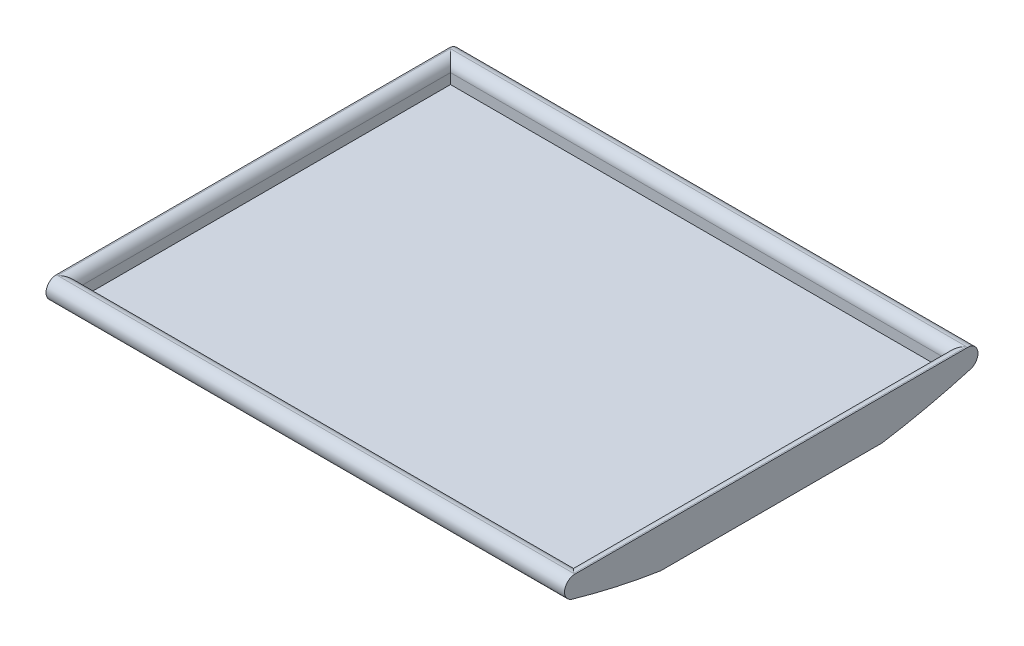
ISO-10303-21;
HEADER;
FILE_DESCRIPTION(('STEP AP214'),'2;1');
FILE_NAME('part.step','',(''),(''),'','','');
FILE_SCHEMA(('AUTOMOTIVE_DESIGN { 1 0 10303 214 1 1 1 1 }'));
ENDSEC;
DATA;
#1=APPLICATION_CONTEXT('core data for automotive mechanical design processes');
#2=APPLICATION_PROTOCOL_DEFINITION('international standard','automotive_design',2000,#1);
#3=PRODUCT_CONTEXT('',#1,'mechanical');
#4=PRODUCT('Part','Part','',(#3));
#5=PRODUCT_RELATED_PRODUCT_CATEGORY('part','',(#4));
#6=PRODUCT_DEFINITION_FORMATION('','',#4);
#7=PRODUCT_DEFINITION_CONTEXT('part definition',#1,'design');
#8=PRODUCT_DEFINITION('design','',#6,#7);
#9=PRODUCT_DEFINITION_SHAPE('','',#8);
#10=(LENGTH_UNIT() NAMED_UNIT(*) SI_UNIT(.MILLI.,.METRE.));
#11=(NAMED_UNIT(*) PLANE_ANGLE_UNIT() SI_UNIT($,.RADIAN.));
#12=(NAMED_UNIT(*) SI_UNIT($,.STERADIAN.) SOLID_ANGLE_UNIT());
#13=UNCERTAINTY_MEASURE_WITH_UNIT(LENGTH_MEASURE(1.E-05),#10,'distance_accuracy_value','');
#14=(GEOMETRIC_REPRESENTATION_CONTEXT(3) GLOBAL_UNCERTAINTY_ASSIGNED_CONTEXT((#13)) GLOBAL_UNIT_ASSIGNED_CONTEXT((#10,
#11,#12)) REPRESENTATION_CONTEXT('',''));
#15=CARTESIAN_POINT('',(0.,0.,0.));
#16=DIRECTION('',(0.,0.,1.));
#17=DIRECTION('',(1.,0.,0.));
#18=AXIS2_PLACEMENT_3D('',#15,#16,#17);
#19=CARTESIAN_POINT('',(35.,-1.55324312984151,-17.4264168846469));
#20=DIRECTION('',(0.,-1.,0.));
#21=DIRECTION('',(0.,0.,-1.));
#22=AXIS2_PLACEMENT_3D('',#19,#20,#21);
#23=PLANE('',#22);
#24=DIRECTION('',(-1.,0.,0.));
#25=VECTOR('',#24,1.);
#26=CARTESIAN_POINT('',(35.,-1.5532431298415,-32.5735831153531));
#27=LINE('',#26,#25);
#28=CARTESIAN_POINT('',(35.,-1.5532431298415,-32.5735831153531));
#29=VERTEX_POINT('',#28);
#30=CARTESIAN_POINT('',(34.9504058124932,-1.5532431298415,-32.5735831153531));
#31=VERTEX_POINT('',#30);
#32=EDGE_CURVE('E206',#29,#31,#27,.T.);
#33=ORIENTED_EDGE('',*,*,#32,.T.);
#34=DIRECTION('',(0.,0.,-1.));
#35=VECTOR('',#34,1.);
#36=CARTESIAN_POINT('',(34.9504058124932,-1.55324312984151,-17.4264168846469));
#37=LINE('',#36,#35);
#38=CARTESIAN_POINT('',(34.9504058124932,-1.55324312984151,-17.4264168846469));
#39=VERTEX_POINT('',#38);
#40=EDGE_CURVE('E239',#31,#39,#37,.F.);
#41=ORIENTED_EDGE('',*,*,#40,.T.);
#42=DIRECTION('',(-1.,0.,0.));
#43=VECTOR('',#42,1.);
#44=CARTESIAN_POINT('',(35.,-1.55324312984151,-17.4264168846469));
#45=LINE('',#44,#43);
#46=CARTESIAN_POINT('',(35.,-1.55324312984151,-17.4264168846469));
#47=VERTEX_POINT('',#46);
#48=EDGE_CURVE('E202',#47,#39,#45,.T.);
#49=ORIENTED_EDGE('',*,*,#48,.F.);
#50=DIRECTION('',(0.,0.,1.));
#51=VECTOR('',#50,1.);
#52=CARTESIAN_POINT('',(35.,-1.55324312984151,-17.4264168846469));
#53=LINE('',#52,#51);
#54=EDGE_CURVE('E186',#29,#47,#53,.T.);
#55=ORIENTED_EDGE('',*,*,#54,.F.);
#56=EDGE_LOOP('',(#33,#41,#49,#55));
#57=FACE_BOUND('',#56,.T.);
#58=ADVANCED_FACE('F36',(#57),#23,.F.);
#59=CARTESIAN_POINT('',(35.,-1.95324312984151,-17.4264168846469));
#60=DIRECTION('',(-1.,0.,0.));
#61=DIRECTION('',(0.,0.,1.));
#62=AXIS2_PLACEMENT_3D('',#59,#60,#61);
#63=CYLINDRICAL_SURFACE('',#62,0.400000000000001);
#64=ORIENTED_EDGE('',*,*,#48,.T.);
#65=CARTESIAN_POINT('',(34.9504058124932,-1.95324312984151,-17.4264168846469));
#66=DIRECTION('',(-0.707106781186547,0.,-0.707106781186547));
#67=DIRECTION('',(0.707106781186547,0.,-0.707106781186547));
#68=AXIS2_PLACEMENT_3D('',#65,#66,#67);
#69=ELLIPSE('',#68,0.565685424949239,0.400000000000001);
#70=CARTESIAN_POINT('',(34.9482553964224,-1.55324891024487,-17.4242664685759));
#71=VERTEX_POINT('',#70);
#72=EDGE_CURVE('E228',#39,#71,#69,.F.);
#73=ORIENTED_EDGE('',*,*,#72,.T.);
#74=DIRECTION('',(-1.,0.,0.));
#75=VECTOR('',#74,1.);
#76=CARTESIAN_POINT('',(25.,-1.55324891024487,-17.4242664685759));
#77=LINE('',#76,#75);
#78=CARTESIAN_POINT('',(15.0517446035777,-1.55324891024487,-17.424266468576));
#79=VERTEX_POINT('',#78);
#80=EDGE_CURVE('E225',#71,#79,#77,.T.);
#81=ORIENTED_EDGE('',*,*,#80,.T.);
#82=CARTESIAN_POINT('',(15.0495941875068,-1.95324312984151,-17.4264168846469));
#83=DIRECTION('',(-0.707106781186547,0.,0.707106781186547));
#84=DIRECTION('',(0.707106781186547,0.,0.707106781186547));
#85=AXIS2_PLACEMENT_3D('',#82,#83,#84);
#86=ELLIPSE('',#85,0.565685424949239,0.400000000000001);
#87=CARTESIAN_POINT('',(15.0495941875068,-1.55324312984151,-17.4264168846469));
#88=VERTEX_POINT('',#87);
#89=EDGE_CURVE('E223',#79,#88,#86,.T.);
#90=ORIENTED_EDGE('',*,*,#89,.T.);
#91=CARTESIAN_POINT('',(15.,-1.55324312984151,-17.4264168846469));
#92=VERTEX_POINT('',#91);
#93=EDGE_CURVE('E188',#88,#92,#45,.T.);
#94=ORIENTED_EDGE('',*,*,#93,.T.);
#95=CARTESIAN_POINT('',(15.,-1.95324312984151,-17.4264168846469));
#96=DIRECTION('',(1.,0.,0.));
#97=DIRECTION('',(0.,0.,1.));
#98=AXIS2_PLACEMENT_3D('',#95,#96,#97);
#99=CIRCLE('',#98,0.400000000000001);
#100=CARTESIAN_POINT('',(15.,-2.33741096468154,-17.3149939306638));
#101=VERTEX_POINT('',#100);
#102=EDGE_CURVE('E170',#92,#101,#99,.T.);
#103=ORIENTED_EDGE('',*,*,#102,.T.);
#104=DIRECTION('',(-1.,0.,0.));
#105=VECTOR('',#104,1.);
#106=CARTESIAN_POINT('',(35.,-2.33741096468154,-17.3149939306638));
#107=LINE('',#106,#105);
#108=CARTESIAN_POINT('',(35.,-2.33741096468154,-17.3149939306638));
#109=VERTEX_POINT('',#108);
#110=EDGE_CURVE('E218',#109,#101,#107,.T.);
#111=ORIENTED_EDGE('',*,*,#110,.F.);
#112=CARTESIAN_POINT('',(35.,-1.95324312984151,-17.4264168846469));
#113=DIRECTION('',(1.,0.,0.));
#114=DIRECTION('',(0.,0.,1.));
#115=AXIS2_PLACEMENT_3D('',#112,#113,#114);
#116=CIRCLE('',#115,0.400000000000001);
#117=EDGE_CURVE('E174',#47,#109,#116,.T.);
#118=ORIENTED_EDGE('',*,*,#117,.F.);
#119=EDGE_LOOP('',(#64,#73,#81,#90,#94,#103,#111,#118));
#120=FACE_BOUND('',#119,.T.);
#121=ADVANCED_FACE('F277',(#120),#63,.T.);
#122=CARTESIAN_POINT('',(35.,24.1592132662403,-25.));
#123=DIRECTION('',(-1.,0.,0.));
#124=DIRECTION('',(0.,0.,1.));
#125=AXIS2_PLACEMENT_3D('',#122,#123,#124);
#126=CYLINDRICAL_SURFACE('',#125,27.5885920974668);
#127=CARTESIAN_POINT('',(15.,24.1592132662403,-25.));
#128=DIRECTION('',(1.,0.,0.));
#129=DIRECTION('',(0.,0.,-1.));
#130=AXIS2_PLACEMENT_3D('',#127,#128,#129);
#131=CIRCLE('',#130,27.5885920974668);
#132=CARTESIAN_POINT('',(15.,-3.09785487617177,-20.7358881111873));
#133=VERTEX_POINT('',#132);
#134=EDGE_CURVE('E191',#101,#133,#131,.T.);
#135=ORIENTED_EDGE('',*,*,#134,.T.);
#136=DIRECTION('',(-1.,0.,0.));
#137=VECTOR('',#136,1.);
#138=CARTESIAN_POINT('',(35.,-3.09785487617177,-20.7358881111873));
#139=LINE('',#138,#137);
#140=CARTESIAN_POINT('',(35.,-3.09785487617177,-20.7358881111873));
#141=VERTEX_POINT('',#140);
#142=EDGE_CURVE('E215',#141,#133,#139,.T.);
#143=ORIENTED_EDGE('',*,*,#142,.F.);
#144=CARTESIAN_POINT('',(35.,24.1592132662403,-25.));
#145=DIRECTION('',(1.,0.,0.));
#146=DIRECTION('',(0.,0.,-1.));
#147=AXIS2_PLACEMENT_3D('',#144,#145,#146);
#148=CIRCLE('',#147,27.5885920974668);
#149=EDGE_CURVE('E177',#109,#141,#148,.T.);
#150=ORIENTED_EDGE('',*,*,#149,.F.);
#151=ORIENTED_EDGE('',*,*,#110,.T.);
#152=EDGE_LOOP('',(#135,#143,#150,#151));
#153=FACE_BOUND('',#152,.T.);
#154=ADVANCED_FACE('F284',(#153),#126,.T.);
#155=CARTESIAN_POINT('',(35.,-3.09785487617177,-29.2641118888126));
#156=DIRECTION('',(0.,1.,0.));
#157=DIRECTION('',(0.,0.,1.));
#158=AXIS2_PLACEMENT_3D('',#155,#156,#157);
#159=PLANE('',#158);
#160=DIRECTION('',(0.,0.,-1.));
#161=VECTOR('',#160,1.);
#162=CARTESIAN_POINT('',(15.,-3.09785487617177,-29.2641118888126));
#163=LINE('',#162,#161);
#164=CARTESIAN_POINT('',(15.,-3.09785487617177,-29.2641118888126));
#165=VERTEX_POINT('',#164);
#166=EDGE_CURVE('E193',#133,#165,#163,.T.);
#167=ORIENTED_EDGE('',*,*,#166,.T.);
#168=DIRECTION('',(-1.,0.,0.));
#169=VECTOR('',#168,1.);
#170=CARTESIAN_POINT('',(35.,-3.09785487617177,-29.2641118888126));
#171=LINE('',#170,#169);
#172=CARTESIAN_POINT('',(35.,-3.09785487617177,-29.2641118888126));
#173=VERTEX_POINT('',#172);
#174=EDGE_CURVE('E212',#173,#165,#171,.T.);
#175=ORIENTED_EDGE('',*,*,#174,.F.);
#176=DIRECTION('',(0.,0.,-1.));
#177=VECTOR('',#176,1.);
#178=CARTESIAN_POINT('',(35.,-3.09785487617177,-29.2641118888126));
#179=LINE('',#178,#177);
#180=EDGE_CURVE('E180',#141,#173,#179,.T.);
#181=ORIENTED_EDGE('',*,*,#180,.F.);
#182=ORIENTED_EDGE('',*,*,#142,.T.);
#183=EDGE_LOOP('',(#167,#175,#181,#182));
#184=FACE_BOUND('',#183,.T.);
#185=ADVANCED_FACE('F323',(#184),#159,.F.);
#186=CARTESIAN_POINT('',(35.,24.1592132662403,-25.));
#187=DIRECTION('',(-1.,0.,0.));
#188=DIRECTION('',(0.,0.,1.));
#189=AXIS2_PLACEMENT_3D('',#186,#187,#188);
#190=CYLINDRICAL_SURFACE('',#189,27.5885920974668);
#191=CARTESIAN_POINT('',(15.,24.1592132662403,-25.));
#192=DIRECTION('',(1.,0.,0.));
#193=DIRECTION('',(0.,0.,-1.));
#194=AXIS2_PLACEMENT_3D('',#191,#192,#193);
#195=CIRCLE('',#194,27.5885920974668);
#196=CARTESIAN_POINT('',(15.,-2.33741096468155,-32.6850060693361));
#197=VERTEX_POINT('',#196);
#198=EDGE_CURVE('E195',#165,#197,#195,.T.);
#199=ORIENTED_EDGE('',*,*,#198,.T.);
#200=DIRECTION('',(-1.,0.,0.));
#201=VECTOR('',#200,1.);
#202=CARTESIAN_POINT('',(35.,-2.33741096468155,-32.6850060693361));
#203=LINE('',#202,#201);
#204=CARTESIAN_POINT('',(35.,-2.33741096468155,-32.6850060693361));
#205=VERTEX_POINT('',#204);
#206=EDGE_CURVE('E209',#205,#197,#203,.T.);
#207=ORIENTED_EDGE('',*,*,#206,.F.);
#208=CARTESIAN_POINT('',(35.,24.1592132662403,-25.));
#209=DIRECTION('',(1.,0.,0.));
#210=DIRECTION('',(0.,0.,-1.));
#211=AXIS2_PLACEMENT_3D('',#208,#209,#210);
#212=CIRCLE('',#211,27.5885920974668);
#213=EDGE_CURVE('E182',#173,#205,#212,.T.);
#214=ORIENTED_EDGE('',*,*,#213,.F.);
#215=ORIENTED_EDGE('',*,*,#174,.T.);
#216=EDGE_LOOP('',(#199,#207,#214,#215));
#217=FACE_BOUND('',#216,.T.);
#218=ADVANCED_FACE('F299',(#217),#190,.T.);
#219=CARTESIAN_POINT('',(35.,-1.95324312984151,-32.5735831153531));
#220=DIRECTION('',(-1.,0.,0.));
#221=DIRECTION('',(0.,0.,1.));
#222=AXIS2_PLACEMENT_3D('',#219,#220,#221);
#223=CYLINDRICAL_SURFACE('',#222,0.400000000000002);
#224=DIRECTION('',(-1.,0.,0.));
#225=VECTOR('',#224,1.);
#226=CARTESIAN_POINT('',(25.,-1.55324891024487,-32.5757335314241));
#227=LINE('',#226,#225);
#228=CARTESIAN_POINT('',(15.0517446035777,-1.55324891024487,-32.575733531424));
#229=VERTEX_POINT('',#228);
#230=CARTESIAN_POINT('',(34.9482553964224,-1.55324891024487,-32.5757335314241));
#231=VERTEX_POINT('',#230);
#232=EDGE_CURVE('E60',#229,#231,#227,.F.);
#233=ORIENTED_EDGE('',*,*,#232,.T.);
#234=CARTESIAN_POINT('',(34.9504058124932,-1.95324312984151,-32.5735831153531));
#235=DIRECTION('',(0.707106781186547,0.,-0.707106781186547));
#236=DIRECTION('',(-0.707106781186547,0.,-0.707106781186547));
#237=AXIS2_PLACEMENT_3D('',#234,#235,#236);
#238=ELLIPSE('',#237,0.565685424949239,0.400000000000001);
#239=EDGE_CURVE('E235',#231,#31,#238,.T.);
#240=ORIENTED_EDGE('',*,*,#239,.T.);
#241=ORIENTED_EDGE('',*,*,#32,.F.);
#242=CARTESIAN_POINT('',(35.,-1.95324312984151,-32.5735831153531));
#243=DIRECTION('',(1.,0.,0.));
#244=DIRECTION('',(0.,0.,1.));
#245=AXIS2_PLACEMENT_3D('',#242,#243,#244);
#246=CIRCLE('',#245,0.400000000000002);
#247=EDGE_CURVE('E184',#205,#29,#246,.T.);
#248=ORIENTED_EDGE('',*,*,#247,.F.);
#249=ORIENTED_EDGE('',*,*,#206,.T.);
#250=CARTESIAN_POINT('',(15.,-1.95324312984151,-32.5735831153531));
#251=DIRECTION('',(1.,0.,0.));
#252=DIRECTION('',(0.,0.,1.));
#253=AXIS2_PLACEMENT_3D('',#250,#251,#252);
#254=CIRCLE('',#253,0.400000000000002);
#255=CARTESIAN_POINT('',(15.,-1.5532431298415,-32.5735831153531));
#256=VERTEX_POINT('',#255);
#257=EDGE_CURVE('E197',#197,#256,#254,.T.);
#258=ORIENTED_EDGE('',*,*,#257,.T.);
#259=CARTESIAN_POINT('',(15.0495941875068,-1.5532431298415,-32.5735831153531));
#260=VERTEX_POINT('',#259);
#261=EDGE_CURVE('E205',#260,#256,#27,.T.);
#262=ORIENTED_EDGE('',*,*,#261,.F.);
#263=CARTESIAN_POINT('',(15.0495941875068,-1.95324312984151,-32.5735831153531));
#264=DIRECTION('',(0.707106781186547,0.,0.707106781186547));
#265=DIRECTION('',(-0.707106781186547,0.,0.707106781186547));
#266=AXIS2_PLACEMENT_3D('',#263,#264,#265);
#267=ELLIPSE('',#266,0.565685424949239,0.400000000000001);
#268=EDGE_CURVE('E232',#260,#229,#267,.F.);
#269=ORIENTED_EDGE('',*,*,#268,.T.);
#270=EDGE_LOOP('',(#233,#240,#241,#248,#249,#258,#262,#269));
#271=FACE_BOUND('',#270,.T.);
#272=ADVANCED_FACE('F291',(#271),#223,.T.);
#273=ORIENTED_EDGE('',*,*,#93,.F.);
#274=DIRECTION('',(0.,0.,1.));
#275=VECTOR('',#274,1.);
#276=CARTESIAN_POINT('',(15.0495941875068,-1.55324312984151,-17.4264168846469));
#277=LINE('',#276,#275);
#278=EDGE_CURVE('E237',#88,#260,#277,.F.);
#279=ORIENTED_EDGE('',*,*,#278,.T.);
#280=ORIENTED_EDGE('',*,*,#261,.T.);
#281=DIRECTION('',(0.,0.,1.));
#282=VECTOR('',#281,1.);
#283=CARTESIAN_POINT('',(15.,-1.55324312984151,-17.4264168846469));
#284=LINE('',#283,#282);
#285=EDGE_CURVE('E178',#256,#92,#284,.T.);
#286=ORIENTED_EDGE('',*,*,#285,.T.);
#287=EDGE_LOOP('',(#273,#279,#280,#286));
#288=FACE_BOUND('',#287,.T.);
#289=ADVANCED_FACE('F280',(#288),#23,.F.);
#290=CARTESIAN_POINT('',(35.,-1.95324312984151,-17.4264168846469));
#291=DIRECTION('',(-1.,0.,0.));
#292=DIRECTION('',(0.,0.,1.));
#293=AXIS2_PLACEMENT_3D('',#290,#291,#292);
#294=PLANE('',#293);
#295=ORIENTED_EDGE('',*,*,#117,.T.);
#296=ORIENTED_EDGE('',*,*,#149,.T.);
#297=ORIENTED_EDGE('',*,*,#180,.T.);
#298=ORIENTED_EDGE('',*,*,#213,.T.);
#299=ORIENTED_EDGE('',*,*,#247,.T.);
#300=ORIENTED_EDGE('',*,*,#54,.T.);
#301=EDGE_LOOP('',(#295,#296,#297,#298,#299,#300));
#302=FACE_BOUND('',#301,.T.);
#303=ADVANCED_FACE('F290',(#302),#294,.F.);
#304=CARTESIAN_POINT('',(15.,-1.95324312984151,-17.4264168846469));
#305=DIRECTION('',(-1.,0.,0.));
#306=DIRECTION('',(0.,0.,1.));
#307=AXIS2_PLACEMENT_3D('',#304,#305,#306);
#308=PLANE('',#307);
#309=ORIENTED_EDGE('',*,*,#102,.F.);
#310=ORIENTED_EDGE('',*,*,#285,.F.);
#311=ORIENTED_EDGE('',*,*,#257,.F.);
#312=ORIENTED_EDGE('',*,*,#198,.F.);
#313=ORIENTED_EDGE('',*,*,#166,.F.);
#314=ORIENTED_EDGE('',*,*,#134,.F.);
#315=EDGE_LOOP('',(#309,#310,#311,#312,#313,#314));
#316=FACE_BOUND('',#315,.T.);
#317=ADVANCED_FACE('F273',(#316),#308,.T.);
#318=CARTESIAN_POINT('',(15.4495941875068,-2.35324312984151,-32.1778839474949));
#319=DIRECTION('',(-1.,0.,0.));
#320=DIRECTION('',(0.,0.,1.));
#321=AXIS2_PLACEMENT_3D('',#318,#319,#320);
#322=PLANE('',#321);
#323=DIRECTION('',(0.,1.,0.));
#324=VECTOR('',#323,1.);
#325=CARTESIAN_POINT('',(15.4495941875068,-2.35324312984151,-32.1778839474949));
#326=LINE('',#325,#324);
#327=CARTESIAN_POINT('',(15.4495941875068,-2.35324312984151,-32.1778839474949));
#328=VERTEX_POINT('',#327);
#329=CARTESIAN_POINT('',(15.4495941875068,-1.95324312984151,-32.1778839474949));
#330=VERTEX_POINT('',#329);
#331=EDGE_CURVE('E168',#328,#330,#326,.T.);
#332=ORIENTED_EDGE('',*,*,#331,.T.);
#333=DIRECTION('',(0.,0.,1.));
#334=VECTOR('',#333,1.);
#335=CARTESIAN_POINT('',(15.4495941875068,-1.95324312984151,-32.1778839474949));
#336=LINE('',#335,#334);
#337=CARTESIAN_POINT('',(15.4495941875068,-1.95324312984151,-17.8221160525051));
#338=VERTEX_POINT('',#337);
#339=EDGE_CURVE('E11',#330,#338,#336,.T.);
#340=ORIENTED_EDGE('',*,*,#339,.T.);
#341=DIRECTION('',(0.,1.,0.));
#342=VECTOR('',#341,1.);
#343=CARTESIAN_POINT('',(15.4495941875068,-2.35324312984151,-17.8221160525051));
#344=LINE('',#343,#342);
#345=CARTESIAN_POINT('',(15.4495941875068,-2.35324312984151,-17.8221160525051));
#346=VERTEX_POINT('',#345);
#347=EDGE_CURVE('E138',#346,#338,#344,.T.);
#348=ORIENTED_EDGE('',*,*,#347,.F.);
#349=DIRECTION('',(0.,0.,1.));
#350=VECTOR('',#349,1.);
#351=CARTESIAN_POINT('',(15.4495941875068,-2.35324312984151,-32.1778839474949));
#352=LINE('',#351,#350);
#353=EDGE_CURVE('E142',#328,#346,#352,.T.);
#354=ORIENTED_EDGE('',*,*,#353,.F.);
#355=EDGE_LOOP('',(#332,#340,#348,#354));
#356=FACE_BOUND('',#355,.T.);
#357=ADVANCED_FACE('F140',(#356),#322,.F.);
#358=CARTESIAN_POINT('',(15.4495941875068,-2.35324312984151,-32.1778839474949));
#359=DIRECTION('',(0.,0.,-1.));
#360=DIRECTION('',(-1.,0.,0.));
#361=AXIS2_PLACEMENT_3D('',#358,#359,#360);
#362=PLANE('',#361);
#363=DIRECTION('',(0.,1.,0.));
#364=VECTOR('',#363,1.);
#365=CARTESIAN_POINT('',(34.5504058124932,-2.35324312984151,-32.1778839474949));
#366=LINE('',#365,#364);
#367=CARTESIAN_POINT('',(34.5504058124932,-2.35324312984151,-32.1778839474949));
#368=VERTEX_POINT('',#367);
#369=CARTESIAN_POINT('',(34.5504058124932,-1.95324312984151,-32.1778839474949));
#370=VERTEX_POINT('',#369);
#371=EDGE_CURVE('E171',#368,#370,#366,.T.);
#372=ORIENTED_EDGE('',*,*,#371,.T.);
#373=DIRECTION('',(-1.,0.,0.));
#374=VECTOR('',#373,1.);
#375=CARTESIAN_POINT('',(15.4495941875068,-1.95324312984151,-32.1778839474949));
#376=LINE('',#375,#374);
#377=EDGE_CURVE('E45',#370,#330,#376,.T.);
#378=ORIENTED_EDGE('',*,*,#377,.T.);
#379=ORIENTED_EDGE('',*,*,#331,.F.);
#380=DIRECTION('',(-1.,0.,0.));
#381=VECTOR('',#380,1.);
#382=CARTESIAN_POINT('',(15.4495941875068,-2.35324312984151,-32.1778839474949));
#383=LINE('',#382,#381);
#384=EDGE_CURVE('E149',#368,#328,#383,.T.);
#385=ORIENTED_EDGE('',*,*,#384,.F.);
#386=EDGE_LOOP('',(#372,#378,#379,#385));
#387=FACE_BOUND('',#386,.T.);
#388=ADVANCED_FACE('F265',(#387),#362,.F.);
#389=CARTESIAN_POINT('',(34.5504058124932,-2.35324312984151,-32.1778839474949));
#390=DIRECTION('',(1.,0.,0.));
#391=DIRECTION('',(0.,0.,-1.));
#392=AXIS2_PLACEMENT_3D('',#389,#390,#391);
#393=PLANE('',#392);
#394=DIRECTION('',(0.,1.,0.));
#395=VECTOR('',#394,1.);
#396=CARTESIAN_POINT('',(34.5504058124932,-2.35324312984151,-17.8221160525051));
#397=LINE('',#396,#395);
#398=CARTESIAN_POINT('',(34.5504058124932,-2.35324312984151,-17.8221160525051));
#399=VERTEX_POINT('',#398);
#400=CARTESIAN_POINT('',(34.5504058124932,-1.95324312984151,-17.8221160525051));
#401=VERTEX_POINT('',#400);
#402=EDGE_CURVE('E148',#399,#401,#397,.T.);
#403=ORIENTED_EDGE('',*,*,#402,.T.);
#404=DIRECTION('',(0.,0.,-1.));
#405=VECTOR('',#404,1.);
#406=CARTESIAN_POINT('',(34.5504058124932,-1.95324312984151,-32.1778839474949));
#407=LINE('',#406,#405);
#408=EDGE_CURVE('E230',#401,#370,#407,.T.);
#409=ORIENTED_EDGE('',*,*,#408,.T.);
#410=ORIENTED_EDGE('',*,*,#371,.F.);
#411=DIRECTION('',(0.,0.,-1.));
#412=VECTOR('',#411,1.);
#413=CARTESIAN_POINT('',(34.5504058124932,-2.35324312984151,-32.1778839474949));
#414=LINE('',#413,#412);
#415=EDGE_CURVE('E158',#399,#368,#414,.T.);
#416=ORIENTED_EDGE('',*,*,#415,.F.);
#417=EDGE_LOOP('',(#403,#409,#410,#416));
#418=FACE_BOUND('',#417,.T.);
#419=ADVANCED_FACE('F264',(#418),#393,.F.);
#420=CARTESIAN_POINT('',(15.4495941875068,-2.35324312984151,-17.8221160525051));
#421=DIRECTION('',(0.,0.,1.));
#422=DIRECTION('',(1.,0.,0.));
#423=AXIS2_PLACEMENT_3D('',#420,#421,#422);
#424=PLANE('',#423);
#425=ORIENTED_EDGE('',*,*,#347,.T.);
#426=DIRECTION('',(1.,0.,0.));
#427=VECTOR('',#426,1.);
#428=CARTESIAN_POINT('',(15.4495941875068,-1.95324312984151,-17.8221160525051));
#429=LINE('',#428,#427);
#430=EDGE_CURVE('E221',#338,#401,#429,.T.);
#431=ORIENTED_EDGE('',*,*,#430,.T.);
#432=ORIENTED_EDGE('',*,*,#402,.F.);
#433=DIRECTION('',(1.,0.,0.));
#434=VECTOR('',#433,1.);
#435=CARTESIAN_POINT('',(15.4495941875068,-2.35324312984151,-17.8221160525051));
#436=LINE('',#435,#434);
#437=EDGE_CURVE('E152',#346,#399,#436,.T.);
#438=ORIENTED_EDGE('',*,*,#437,.F.);
#439=EDGE_LOOP('',(#425,#431,#432,#438));
#440=FACE_BOUND('',#439,.T.);
#441=ADVANCED_FACE('F153',(#440),#424,.F.);
#442=CARTESIAN_POINT('',(15.4495941875068,-2.35324312984151,-17.8221160525051));
#443=DIRECTION('',(0.,1.,0.));
#444=DIRECTION('',(0.,0.,1.));
#445=AXIS2_PLACEMENT_3D('',#442,#443,#444);
#446=PLANE('',#445);
#447=ORIENTED_EDGE('',*,*,#353,.T.);
#448=ORIENTED_EDGE('',*,*,#437,.T.);
#449=ORIENTED_EDGE('',*,*,#415,.T.);
#450=ORIENTED_EDGE('',*,*,#384,.T.);
#451=EDGE_LOOP('',(#447,#448,#449,#450));
#452=FACE_BOUND('',#451,.T.);
#453=ADVANCED_FACE('F160',(#452),#446,.T.);
#454=CARTESIAN_POINT('',(15.4495941875068,-1.95324312984151,-32.5778839474949));
#455=DIRECTION('',(-1.,0.,0.));
#456=DIRECTION('',(0.,0.,1.));
#457=AXIS2_PLACEMENT_3D('',#454,#455,#456);
#458=CYLINDRICAL_SURFACE('',#457,0.4);
#459=CARTESIAN_POINT('',(34.9504058124932,-1.95324312984151,-32.5778839474949));
#460=DIRECTION('',(-0.707106781186547,0.,-0.707106781186547));
#461=DIRECTION('',(-0.707106781186547,0.,0.707106781186547));
#462=AXIS2_PLACEMENT_3D('',#459,#460,#461);
#463=ELLIPSE('',#462,0.565685424949238,0.4);
#464=EDGE_CURVE('E164',#231,#370,#463,.F.);
#465=ORIENTED_EDGE('',*,*,#464,.F.);
#466=ORIENTED_EDGE('',*,*,#232,.F.);
#467=CARTESIAN_POINT('',(15.0495941875068,-1.95324312984151,-32.5778839474949));
#468=DIRECTION('',(-0.707106781186547,0.,0.707106781186547));
#469=DIRECTION('',(0.707106781186547,0.,0.707106781186547));
#470=AXIS2_PLACEMENT_3D('',#467,#468,#469);
#471=ELLIPSE('',#470,0.565685424949238,0.4);
#472=EDGE_CURVE('E40',#330,#229,#471,.T.);
#473=ORIENTED_EDGE('',*,*,#472,.F.);
#474=ORIENTED_EDGE('',*,*,#377,.F.);
#475=EDGE_LOOP('',(#465,#466,#473,#474));
#476=FACE_BOUND('',#475,.T.);
#477=ADVANCED_FACE('F38',(#476),#458,.T.);
#478=CARTESIAN_POINT('',(15.0495941875068,-1.95324312984151,-32.1778839474949));
#479=DIRECTION('',(0.,0.,1.));
#480=DIRECTION('',(1.,0.,0.));
#481=AXIS2_PLACEMENT_3D('',#478,#479,#480);
#482=CYLINDRICAL_SURFACE('',#481,0.4);
#483=ORIENTED_EDGE('',*,*,#278,.F.);
#484=ORIENTED_EDGE('',*,*,#89,.F.);
#485=CARTESIAN_POINT('',(15.0495941875068,-1.95324312984151,-17.4221160525051));
#486=DIRECTION('',(0.707106781186547,0.,0.707106781186547));
#487=DIRECTION('',(-0.707106781186547,0.,0.707106781186547));
#488=AXIS2_PLACEMENT_3D('',#485,#486,#487);
#489=ELLIPSE('',#488,0.565685424949238,0.4);
#490=EDGE_CURVE('E244',#338,#79,#489,.T.);
#491=ORIENTED_EDGE('',*,*,#490,.F.);
#492=ORIENTED_EDGE('',*,*,#339,.F.);
#493=ORIENTED_EDGE('',*,*,#472,.T.);
#494=ORIENTED_EDGE('',*,*,#268,.F.);
#495=EDGE_LOOP('',(#483,#484,#491,#492,#493,#494));
#496=FACE_BOUND('',#495,.T.);
#497=ADVANCED_FACE('F257',(#496),#482,.T.);
#498=CARTESIAN_POINT('',(34.9504058124932,-1.95324312984151,-32.1778839474949));
#499=DIRECTION('',(0.,0.,-1.));
#500=DIRECTION('',(-1.,0.,0.));
#501=AXIS2_PLACEMENT_3D('',#498,#499,#500);
#502=CYLINDRICAL_SURFACE('',#501,0.4);
#503=ORIENTED_EDGE('',*,*,#464,.T.);
#504=ORIENTED_EDGE('',*,*,#408,.F.);
#505=CARTESIAN_POINT('',(34.9504058124932,-1.95324312984151,-17.4221160525051));
#506=DIRECTION('',(0.707106781186547,0.,-0.707106781186547));
#507=DIRECTION('',(-0.707106781186547,0.,-0.707106781186547));
#508=AXIS2_PLACEMENT_3D('',#505,#506,#507);
#509=ELLIPSE('',#508,0.565685424949238,0.4);
#510=EDGE_CURVE('E242',#71,#401,#509,.F.);
#511=ORIENTED_EDGE('',*,*,#510,.F.);
#512=ORIENTED_EDGE('',*,*,#72,.F.);
#513=ORIENTED_EDGE('',*,*,#40,.F.);
#514=ORIENTED_EDGE('',*,*,#239,.F.);
#515=EDGE_LOOP('',(#503,#504,#511,#512,#513,#514));
#516=FACE_BOUND('',#515,.T.);
#517=ADVANCED_FACE('F249',(#516),#502,.T.);
#518=CARTESIAN_POINT('',(15.4495941875068,-1.95324312984151,-17.4221160525051));
#519=DIRECTION('',(1.,0.,0.));
#520=DIRECTION('',(0.,0.,-1.));
#521=AXIS2_PLACEMENT_3D('',#518,#519,#520);
#522=CYLINDRICAL_SURFACE('',#521,0.4);
#523=ORIENTED_EDGE('',*,*,#490,.T.);
#524=ORIENTED_EDGE('',*,*,#80,.F.);
#525=ORIENTED_EDGE('',*,*,#510,.T.);
#526=ORIENTED_EDGE('',*,*,#430,.F.);
#527=EDGE_LOOP('',(#523,#524,#525,#526));
#528=FACE_BOUND('',#527,.T.);
#529=ADVANCED_FACE('F262',(#528),#522,.T.);
#530=CLOSED_SHELL('',(#58,#121,#154,#185,#218,#272,#289,#303,#317,#357,#388,#419,#441,#453,#477,
#497,#517,#529));
#531=MANIFOLD_SOLID_BREP('B2',#530);
#532=ADVANCED_BREP_SHAPE_REPRESENTATION('',(#18,#531),#14);
#533=SHAPE_DEFINITION_REPRESENTATION(#9,#532);
ENDSEC;
END-ISO-10303-21;
